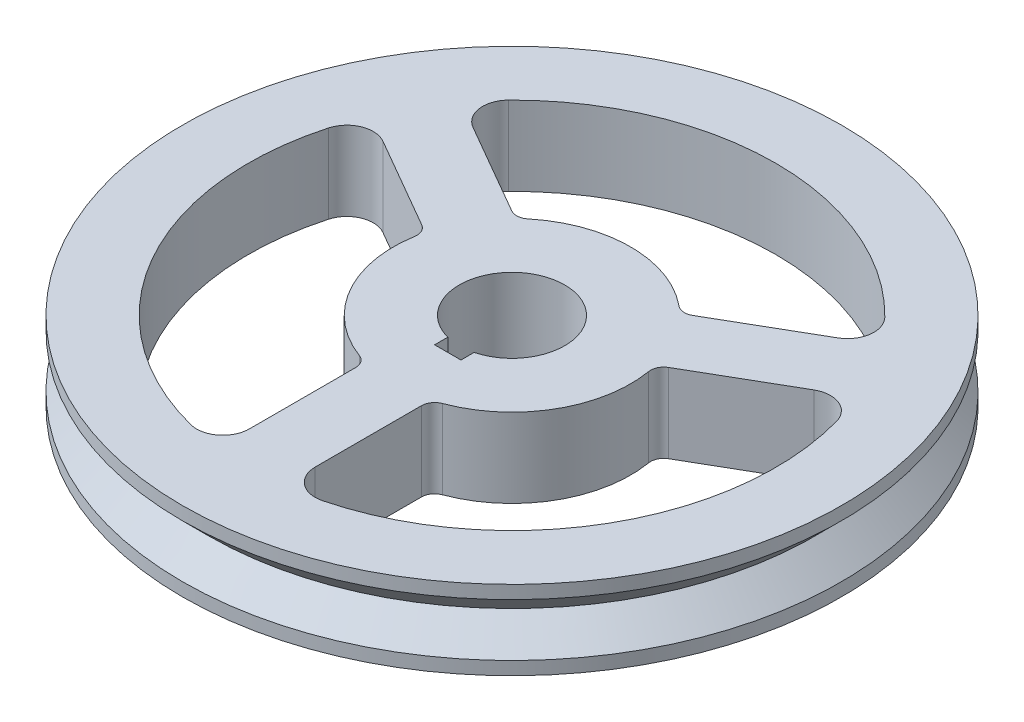
ISO-10303-21;
HEADER;
FILE_DESCRIPTION(('STEP AP214'),'2;1');
FILE_NAME('part.step','',(''),(''),'','','');
FILE_SCHEMA(('AUTOMOTIVE_DESIGN { 1 0 10303 214 1 1 1 1 }'));
ENDSEC;
DATA;
#1=APPLICATION_CONTEXT('core data for automotive mechanical design processes');
#2=APPLICATION_PROTOCOL_DEFINITION('international standard','automotive_design',2000,#1);
#3=PRODUCT_CONTEXT('',#1,'mechanical');
#4=PRODUCT('Part','Part','',(#3));
#5=PRODUCT_RELATED_PRODUCT_CATEGORY('part','',(#4));
#6=PRODUCT_DEFINITION_FORMATION('','',#4);
#7=PRODUCT_DEFINITION_CONTEXT('part definition',#1,'design');
#8=PRODUCT_DEFINITION('design','',#6,#7);
#9=PRODUCT_DEFINITION_SHAPE('','',#8);
#10=(LENGTH_UNIT() NAMED_UNIT(*) SI_UNIT(.MILLI.,.METRE.));
#11=(NAMED_UNIT(*) PLANE_ANGLE_UNIT() SI_UNIT($,.RADIAN.));
#12=(NAMED_UNIT(*) SI_UNIT($,.STERADIAN.) SOLID_ANGLE_UNIT());
#13=UNCERTAINTY_MEASURE_WITH_UNIT(LENGTH_MEASURE(1.E-05),#10,'distance_accuracy_value','');
#14=(GEOMETRIC_REPRESENTATION_CONTEXT(3) GLOBAL_UNCERTAINTY_ASSIGNED_CONTEXT((#13)) GLOBAL_UNIT_ASSIGNED_CONTEXT((#10,
#11,#12)) REPRESENTATION_CONTEXT('',''));
#15=CARTESIAN_POINT('',(0.,0.,0.));
#16=DIRECTION('',(0.,0.,1.));
#17=DIRECTION('',(1.,0.,0.));
#18=AXIS2_PLACEMENT_3D('',#15,#16,#17);
#19=CARTESIAN_POINT('',(0.,15.,0.));
#20=DIRECTION('',(0.,-1.,0.));
#21=DIRECTION('',(0.,0.,-1.));
#22=AXIS2_PLACEMENT_3D('',#19,#20,#21);
#23=CYLINDRICAL_SURFACE('',#22,125.);
#24=CARTESIAN_POINT('',(0.,10.,0.));
#25=DIRECTION('',(0.,1.,0.));
#26=DIRECTION('',(0.,0.,1.));
#27=AXIS2_PLACEMENT_3D('',#24,#25,#26);
#28=CIRCLE('',#27,125.);
#29=CARTESIAN_POINT('',(0.,10.,125.));
#30=VERTEX_POINT('',#29);
#31=EDGE_CURVE('E503',#30,#30,#28,.T.);
#32=ORIENTED_EDGE('',*,*,#31,.T.);
#33=EDGE_LOOP('',(#32));
#34=FACE_BOUND('',#33,.T.);
#35=CARTESIAN_POINT('',(0.,15.,0.));
#36=DIRECTION('',(0.,1.,0.));
#37=DIRECTION('',(0.,0.,1.));
#38=AXIS2_PLACEMENT_3D('',#35,#36,#37);
#39=CIRCLE('',#38,125.);
#40=CARTESIAN_POINT('',(0.,15.,125.));
#41=VERTEX_POINT('',#40);
#42=EDGE_CURVE('E11',#41,#41,#39,.T.);
#43=ORIENTED_EDGE('',*,*,#42,.F.);
#44=EDGE_LOOP('',(#43));
#45=FACE_BOUND('',#44,.T.);
#46=ADVANCED_FACE('F40',(#34,#45),#23,.T.);
#47=CARTESIAN_POINT('',(0.,15.,0.));
#48=DIRECTION('',(0.,1.,0.));
#49=DIRECTION('',(0.,0.,1.));
#50=AXIS2_PLACEMENT_3D('',#47,#48,#49);
#51=PLANE('',#50);
#52=ORIENTED_EDGE('',*,*,#42,.T.);
#53=EDGE_LOOP('',(#52));
#54=FACE_BOUND('',#53,.T.);
#55=DIRECTION('',(0.,0.,-1.));
#56=VECTOR('',#55,1.);
#57=CARTESIAN_POINT('',(-12.5,15.,46.837484987988));
#58=LINE('',#57,#56);
#59=CARTESIAN_POINT('',(-12.4999999999999,15.,87.1421252896669));
#60=VERTEX_POINT('',#59);
#61=CARTESIAN_POINT('',(-12.5,15.,46.837484987988));
#62=VERTEX_POINT('',#61);
#63=EDGE_CURVE('E385',#60,#62,#58,.T.);
#64=ORIENTED_EDGE('',*,*,#63,.F.);
#65=CARTESIAN_POINT('',(-22.5,15.,87.1421252896669));
#66=DIRECTION('',(0.,1.,0.));
#67=DIRECTION('',(0.,0.,-1.));
#68=AXIS2_PLACEMENT_3D('',#65,#66,#67);
#69=CIRCLE('',#68,10.);
#70=CARTESIAN_POINT('',(-25.,15.,96.8245836551854));
#71=VERTEX_POINT('',#70);
#72=EDGE_CURVE('E383',#71,#60,#69,.T.);
#73=ORIENTED_EDGE('',*,*,#72,.F.);
#74=CARTESIAN_POINT('',(0.,15.,0.));
#75=DIRECTION('',(0.,1.,0.));
#76=DIRECTION('',(0.,0.,1.));
#77=AXIS2_PLACEMENT_3D('',#74,#75,#76);
#78=CIRCLE('',#77,100.);
#79=CARTESIAN_POINT('',(-96.352549156242,15.,-26.7616567329822));
#80=VERTEX_POINT('',#79);
#81=EDGE_CURVE('E399',#80,#71,#78,.T.);
#82=ORIENTED_EDGE('',*,*,#81,.F.);
#83=CARTESIAN_POINT('',(-86.7172942406178,15.,-24.085491059684));
#84=DIRECTION('',(0.,1.,0.));
#85=DIRECTION('',(0.,0.,1.));
#86=AXIS2_PLACEMENT_3D('',#83,#84,#85);
#87=CIRCLE('',#86,9.99999999999999);
#88=CARTESIAN_POINT('',(-81.7172942406178,15.,-32.7457450975283));
#89=VERTEX_POINT('',#88);
#90=EDGE_CURVE('E396',#89,#80,#87,.T.);
#91=ORIENTED_EDGE('',*,*,#90,.F.);
#92=DIRECTION('',(-0.866025403784436,0.,-0.500000000000004));
#93=VECTOR('',#92,1.);
#94=CARTESIAN_POINT('',(-46.8124518489698,15.,-12.5934249466887));
#95=LINE('',#94,#93);
#96=CARTESIAN_POINT('',(-46.8124518489698,15.,-12.5934249466887));
#97=VERTEX_POINT('',#96);
#98=EDGE_CURVE('E394',#97,#89,#95,.T.);
#99=ORIENTED_EDGE('',*,*,#98,.F.);
#100=CARTESIAN_POINT('',(-49.3124518489698,15.,-8.26329792776654));
#101=DIRECTION('',(0.,1.,0.));
#102=DIRECTION('',(0.,0.,-1.));
#103=AXIS2_PLACEMENT_3D('',#100,#101,#102);
#104=CIRCLE('',#103,5.);
#105=CARTESIAN_POINT('',(-44.3812066640729,15.,-7.43696813498991));
#106=VERTEX_POINT('',#105);
#107=EDGE_CURVE('E392',#106,#97,#104,.T.);
#108=ORIENTED_EDGE('',*,*,#107,.F.);
#109=CARTESIAN_POINT('',(0.,15.,0.));
#110=DIRECTION('',(0.,-1.,0.));
#111=DIRECTION('',(0.,0.,1.));
#112=AXIS2_PLACEMENT_3D('',#109,#110,#111);
#113=CIRCLE('',#112,45.);
#114=CARTESIAN_POINT('',(-15.75,15.,42.1537364891892));
#115=VERTEX_POINT('',#114);
#116=EDGE_CURVE('E390',#115,#106,#113,.T.);
#117=ORIENTED_EDGE('',*,*,#116,.F.);
#118=CARTESIAN_POINT('',(-17.5,15.,46.837484987988));
#119=DIRECTION('',(0.,1.,0.));
#120=DIRECTION('',(0.,0.,1.));
#121=AXIS2_PLACEMENT_3D('',#118,#119,#120);
#122=CIRCLE('',#121,4.99999999999999);
#123=EDGE_CURVE('E388',#62,#115,#122,.T.);
#124=ORIENTED_EDGE('',*,*,#123,.F.);
#125=EDGE_LOOP('',(#64,#73,#82,#91,#99,#108,#117,#124));
#126=FACE_BOUND('',#125,.T.);
#127=DIRECTION('',(0.,0.,1.));
#128=VECTOR('',#127,1.);
#129=CARTESIAN_POINT('',(-4.99999999999998,15.,19.3649167310371));
#130=LINE('',#129,#128);
#131=CARTESIAN_POINT('',(-4.99999999999998,15.,19.3649167310371));
#132=VERTEX_POINT('',#131);
#133=CARTESIAN_POINT('',(-4.99999999999998,15.,24.3649167310371));
#134=VERTEX_POINT('',#133);
#135=EDGE_CURVE('E354',#132,#134,#130,.T.);
#136=ORIENTED_EDGE('',*,*,#135,.F.);
#137=CARTESIAN_POINT('',(0.,15.,0.));
#138=DIRECTION('',(0.,1.,0.));
#139=DIRECTION('',(0.,0.,1.));
#140=AXIS2_PLACEMENT_3D('',#137,#138,#139);
#141=CIRCLE('',#140,20.);
#142=CARTESIAN_POINT('',(5.00000000000002,15.,19.3649167310371));
#143=VERTEX_POINT('',#142);
#144=EDGE_CURVE('E352',#143,#132,#141,.T.);
#145=ORIENTED_EDGE('',*,*,#144,.F.);
#146=DIRECTION('',(0.,0.,-1.));
#147=VECTOR('',#146,1.);
#148=CARTESIAN_POINT('',(5.00000000000002,15.,19.3649167310371));
#149=LINE('',#148,#147);
#150=CARTESIAN_POINT('',(5.00000000000002,15.,24.3649167310371));
#151=VERTEX_POINT('',#150);
#152=EDGE_CURVE('E360',#151,#143,#149,.T.);
#153=ORIENTED_EDGE('',*,*,#152,.F.);
#154=DIRECTION('',(1.,0.,0.));
#155=VECTOR('',#154,1.);
#156=CARTESIAN_POINT('',(-4.99999999999998,15.,24.3649167310371));
#157=LINE('',#156,#155);
#158=EDGE_CURVE('E357',#134,#151,#157,.T.);
#159=ORIENTED_EDGE('',*,*,#158,.F.);
#160=EDGE_LOOP('',(#136,#145,#153,#159));
#161=FACE_BOUND('',#160,.T.);
#162=DIRECTION('',(0.866025403784436,0.,0.500000000000004));
#163=VECTOR('',#162,1.);
#164=CARTESIAN_POINT('',(-34.3124518489698,15.,-34.2440600412996));
#165=LINE('',#164,#163);
#166=CARTESIAN_POINT('',(-69.2172942406177,15.,-54.3963801921392));
#167=VERTEX_POINT('',#166);
#168=CARTESIAN_POINT('',(-34.3124518489698,15.,-34.2440600412996));
#169=VERTEX_POINT('',#168);
#170=EDGE_CURVE('E295',#167,#169,#165,.T.);
#171=ORIENTED_EDGE('',*,*,#170,.F.);
#172=CARTESIAN_POINT('',(-64.2172942406176,15.,-63.0566342299836));
#173=DIRECTION('',(0.,1.,0.));
#174=DIRECTION('',(0.,0.,-1.));
#175=AXIS2_PLACEMENT_3D('',#172,#173,#174);
#176=CIRCLE('',#175,10.);
#177=CARTESIAN_POINT('',(-71.3525491562418,15.,-70.062926922204));
#178=VERTEX_POINT('',#177);
#179=EDGE_CURVE('E293',#178,#167,#176,.T.);
#180=ORIENTED_EDGE('',*,*,#179,.F.);
#181=CARTESIAN_POINT('',(0.,15.,0.));
#182=DIRECTION('',(0.,1.,0.));
#183=DIRECTION('',(0.,0.,1.));
#184=AXIS2_PLACEMENT_3D('',#181,#182,#183);
#185=CIRCLE('',#184,100.);
#186=CARTESIAN_POINT('',(71.3525491562428,15.,-70.062926922203));
#187=VERTEX_POINT('',#186);
#188=EDGE_CURVE('E309',#187,#178,#185,.T.);
#189=ORIENTED_EDGE('',*,*,#188,.F.);
#190=CARTESIAN_POINT('',(64.2172942406185,15.,-63.0566342299828));
#191=DIRECTION('',(0.,1.,0.));
#192=DIRECTION('',(0.,0.,1.));
#193=AXIS2_PLACEMENT_3D('',#190,#191,#192);
#194=CIRCLE('',#193,9.99999999999999);
#195=CARTESIAN_POINT('',(69.2172942406184,15.,-54.3963801921383));
#196=VERTEX_POINT('',#195);
#197=EDGE_CURVE('E306',#196,#187,#194,.T.);
#198=ORIENTED_EDGE('',*,*,#197,.F.);
#199=DIRECTION('',(0.866025403784443,0.,-0.499999999999992));
#200=VECTOR('',#199,1.);
#201=CARTESIAN_POINT('',(34.3124518489702,15.,-34.2440600412992));
#202=LINE('',#201,#200);
#203=CARTESIAN_POINT('',(34.3124518489702,15.,-34.2440600412992));
#204=VERTEX_POINT('',#203);
#205=EDGE_CURVE('E304',#204,#196,#202,.T.);
#206=ORIENTED_EDGE('',*,*,#205,.F.);
#207=CARTESIAN_POINT('',(31.8124518489702,15.,-38.5741870602214));
#208=DIRECTION('',(0.,1.,0.));
#209=DIRECTION('',(0.,0.,-1.));
#210=AXIS2_PLACEMENT_3D('',#207,#208,#209);
#211=CIRCLE('',#210,4.99999999999999);
#212=CARTESIAN_POINT('',(28.6312066640732,15.,-34.7167683541992));
#213=VERTEX_POINT('',#212);
#214=EDGE_CURVE('E302',#213,#204,#211,.T.);
#215=ORIENTED_EDGE('',*,*,#214,.F.);
#216=CARTESIAN_POINT('',(0.,15.,0.));
#217=DIRECTION('',(0.,-1.,0.));
#218=DIRECTION('',(0.,0.,1.));
#219=AXIS2_PLACEMENT_3D('',#216,#217,#218);
#220=CIRCLE('',#219,45.);
#221=CARTESIAN_POINT('',(-28.6312066640727,15.,-34.7167683541996));
#222=VERTEX_POINT('',#221);
#223=EDGE_CURVE('E300',#222,#213,#220,.T.);
#224=ORIENTED_EDGE('',*,*,#223,.F.);
#225=CARTESIAN_POINT('',(-31.8124518489697,15.,-38.5741870602218));
#226=DIRECTION('',(0.,1.,0.));
#227=DIRECTION('',(0.,0.,1.));
#228=AXIS2_PLACEMENT_3D('',#225,#226,#227);
#229=CIRCLE('',#228,5.);
#230=EDGE_CURVE('E298',#169,#222,#229,.T.);
#231=ORIENTED_EDGE('',*,*,#230,.F.);
#232=EDGE_LOOP('',(#171,#180,#189,#198,#206,#215,#224,#231));
#233=FACE_BOUND('',#232,.T.);
#234=DIRECTION('',(-0.866025403784443,0.,0.499999999999992));
#235=VECTOR('',#234,1.);
#236=CARTESIAN_POINT('',(46.81245184897,15.,-12.5934249466881));
#237=LINE('',#236,#235);
#238=CARTESIAN_POINT('',(81.7172942406182,15.,-32.7457450975272));
#239=VERTEX_POINT('',#238);
#240=CARTESIAN_POINT('',(46.81245184897,15.,-12.5934249466881));
#241=VERTEX_POINT('',#240);
#242=EDGE_CURVE('E233',#239,#241,#237,.T.);
#243=ORIENTED_EDGE('',*,*,#242,.F.);
#244=CARTESIAN_POINT('',(86.7172942406181,15.,-24.0854910596828));
#245=DIRECTION('',(0.,1.,0.));
#246=DIRECTION('',(0.,0.,-1.));
#247=AXIS2_PLACEMENT_3D('',#244,#245,#246);
#248=CIRCLE('',#247,9.99999999999999);
#249=CARTESIAN_POINT('',(96.3525491562423,15.,-26.7616567329809));
#250=VERTEX_POINT('',#249);
#251=EDGE_CURVE('E225',#250,#239,#248,.T.);
#252=ORIENTED_EDGE('',*,*,#251,.F.);
#253=CARTESIAN_POINT('',(0.,15.,0.));
#254=DIRECTION('',(0.,1.,0.));
#255=DIRECTION('',(0.,0.,1.));
#256=AXIS2_PLACEMENT_3D('',#253,#254,#255);
#257=CIRCLE('',#256,100.);
#258=CARTESIAN_POINT('',(24.9999999999986,15.,96.8245836551857));
#259=VERTEX_POINT('',#258);
#260=EDGE_CURVE('E260',#259,#250,#257,.T.);
#261=ORIENTED_EDGE('',*,*,#260,.F.);
#262=CARTESIAN_POINT('',(22.4999999999996,15.,87.142125289667));
#263=DIRECTION('',(0.,1.,0.));
#264=DIRECTION('',(0.,0.,1.));
#265=AXIS2_PLACEMENT_3D('',#262,#263,#264);
#266=CIRCLE('',#265,10.0000000000004);
#267=CARTESIAN_POINT('',(12.4999999999988,15.,87.142125289667));
#268=VERTEX_POINT('',#267);
#269=EDGE_CURVE('E258',#268,#259,#266,.T.);
#270=ORIENTED_EDGE('',*,*,#269,.F.);
#271=DIRECTION('',(0.,0.,1.));
#272=VECTOR('',#271,1.);
#273=CARTESIAN_POINT('',(12.4999999999994,15.,46.8374849879882));
#274=LINE('',#273,#272);
#275=CARTESIAN_POINT('',(12.4999999999996,15.,46.8374849879882));
#276=VERTEX_POINT('',#275);
#277=EDGE_CURVE('E256',#276,#268,#274,.T.);
#278=ORIENTED_EDGE('',*,*,#277,.F.);
#279=CARTESIAN_POINT('',(17.4999999999998,15.,46.8374849879881));
#280=DIRECTION('',(0.,1.,0.));
#281=DIRECTION('',(0.,0.,-1.));
#282=AXIS2_PLACEMENT_3D('',#279,#280,#281);
#283=CIRCLE('',#282,5.00000000000022);
#284=CARTESIAN_POINT('',(15.7499999999994,15.,42.1537364891894));
#285=VERTEX_POINT('',#284);
#286=EDGE_CURVE('E254',#285,#276,#283,.T.);
#287=ORIENTED_EDGE('',*,*,#286,.F.);
#288=CARTESIAN_POINT('',(0.,15.,0.));
#289=DIRECTION('',(0.,-1.,0.));
#290=DIRECTION('',(0.,0.,1.));
#291=AXIS2_PLACEMENT_3D('',#288,#289,#290);
#292=CIRCLE('',#291,45.);
#293=CARTESIAN_POINT('',(44.3812066640729,15.,-7.4369681349893));
#294=VERTEX_POINT('',#293);
#295=EDGE_CURVE('E249',#294,#285,#292,.T.);
#296=ORIENTED_EDGE('',*,*,#295,.F.);
#297=CARTESIAN_POINT('',(49.3124518489699,15.,-8.26329792776589));
#298=DIRECTION('',(0.,1.,0.));
#299=DIRECTION('',(0.,0.,1.));
#300=AXIS2_PLACEMENT_3D('',#297,#298,#299);
#301=CIRCLE('',#300,5.);
#302=EDGE_CURVE('E247',#241,#294,#301,.T.);
#303=ORIENTED_EDGE('',*,*,#302,.F.);
#304=EDGE_LOOP('',(#243,#252,#261,#270,#278,#287,#296,#303));
#305=FACE_BOUND('',#304,.T.);
#306=ADVANCED_FACE('F245',(#54,#126,#161,#233,#305),#51,.T.);
#307=CARTESIAN_POINT('',(0.,-15.,0.));
#308=DIRECTION('',(0.,1.,0.));
#309=DIRECTION('',(0.,0.,1.));
#310=AXIS2_PLACEMENT_3D('',#307,#308,#309);
#311=PLANE('',#310);
#312=CARTESIAN_POINT('',(-64.2172942406176,-15.,-63.0566342299836));
#313=DIRECTION('',(0.,1.,0.));
#314=DIRECTION('',(0.,0.,-1.));
#315=AXIS2_PLACEMENT_3D('',#312,#313,#314);
#316=CIRCLE('',#315,10.);
#317=CARTESIAN_POINT('',(-71.3525491562418,-15.,-70.062926922204));
#318=VERTEX_POINT('',#317);
#319=CARTESIAN_POINT('',(-69.2172942406177,-15.,-54.3963801921392));
#320=VERTEX_POINT('',#319);
#321=EDGE_CURVE('E241',#318,#320,#316,.T.);
#322=ORIENTED_EDGE('',*,*,#321,.T.);
#323=DIRECTION('',(0.866025403784436,0.,0.500000000000004));
#324=VECTOR('',#323,1.);
#325=CARTESIAN_POINT('',(-34.3124518489698,-15.,-34.2440600412996));
#326=LINE('',#325,#324);
#327=CARTESIAN_POINT('',(-34.3124518489698,-15.,-34.2440600412996));
#328=VERTEX_POINT('',#327);
#329=EDGE_CURVE('E314',#320,#328,#326,.T.);
#330=ORIENTED_EDGE('',*,*,#329,.T.);
#331=CARTESIAN_POINT('',(-31.8124518489697,-15.,-38.5741870602218));
#332=DIRECTION('',(0.,1.,0.));
#333=DIRECTION('',(0.,0.,1.));
#334=AXIS2_PLACEMENT_3D('',#331,#332,#333);
#335=CIRCLE('',#334,5.);
#336=CARTESIAN_POINT('',(-28.6312066640727,-15.,-34.7167683541996));
#337=VERTEX_POINT('',#336);
#338=EDGE_CURVE('E317',#328,#337,#335,.T.);
#339=ORIENTED_EDGE('',*,*,#338,.T.);
#340=CARTESIAN_POINT('',(0.,-15.,0.));
#341=DIRECTION('',(0.,-1.,0.));
#342=DIRECTION('',(0.,0.,1.));
#343=AXIS2_PLACEMENT_3D('',#340,#341,#342);
#344=CIRCLE('',#343,45.);
#345=CARTESIAN_POINT('',(28.6312066640732,-15.,-34.7167683541992));
#346=VERTEX_POINT('',#345);
#347=EDGE_CURVE('E320',#337,#346,#344,.T.);
#348=ORIENTED_EDGE('',*,*,#347,.T.);
#349=CARTESIAN_POINT('',(31.8124518489702,-15.,-38.5741870602214));
#350=DIRECTION('',(0.,1.,0.));
#351=DIRECTION('',(0.,0.,-1.));
#352=AXIS2_PLACEMENT_3D('',#349,#350,#351);
#353=CIRCLE('',#352,4.99999999999999);
#354=CARTESIAN_POINT('',(34.3124518489702,-15.,-34.2440600412992));
#355=VERTEX_POINT('',#354);
#356=EDGE_CURVE('E323',#346,#355,#353,.T.);
#357=ORIENTED_EDGE('',*,*,#356,.T.);
#358=DIRECTION('',(0.866025403784443,0.,-0.499999999999992));
#359=VECTOR('',#358,1.);
#360=CARTESIAN_POINT('',(34.3124518489702,-15.,-34.2440600412992));
#361=LINE('',#360,#359);
#362=CARTESIAN_POINT('',(69.2172942406184,-15.,-54.3963801921383));
#363=VERTEX_POINT('',#362);
#364=EDGE_CURVE('E326',#355,#363,#361,.T.);
#365=ORIENTED_EDGE('',*,*,#364,.T.);
#366=CARTESIAN_POINT('',(64.2172942406185,-15.,-63.0566342299828));
#367=DIRECTION('',(0.,1.,0.));
#368=DIRECTION('',(0.,0.,1.));
#369=AXIS2_PLACEMENT_3D('',#366,#367,#368);
#370=CIRCLE('',#369,9.99999999999999);
#371=CARTESIAN_POINT('',(71.3525491562428,-15.,-70.062926922203));
#372=VERTEX_POINT('',#371);
#373=EDGE_CURVE('E329',#363,#372,#370,.T.);
#374=ORIENTED_EDGE('',*,*,#373,.T.);
#375=CARTESIAN_POINT('',(0.,-15.,0.));
#376=DIRECTION('',(0.,1.,0.));
#377=DIRECTION('',(0.,0.,1.));
#378=AXIS2_PLACEMENT_3D('',#375,#376,#377);
#379=CIRCLE('',#378,100.);
#380=EDGE_CURVE('E296',#372,#318,#379,.T.);
#381=ORIENTED_EDGE('',*,*,#380,.T.);
#382=EDGE_LOOP('',(#322,#330,#339,#348,#357,#365,#374,#381));
#383=FACE_BOUND('',#382,.T.);
#384=CARTESIAN_POINT('',(-22.5,-15.,87.1421252896669));
#385=DIRECTION('',(0.,1.,0.));
#386=DIRECTION('',(0.,0.,-1.));
#387=AXIS2_PLACEMENT_3D('',#384,#385,#386);
#388=CIRCLE('',#387,10.);
#389=CARTESIAN_POINT('',(-25.,-15.,96.8245836551854));
#390=VERTEX_POINT('',#389);
#391=CARTESIAN_POINT('',(-12.4999999999999,-15.,87.1421252896669));
#392=VERTEX_POINT('',#391);
#393=EDGE_CURVE('E382',#390,#392,#388,.T.);
#394=ORIENTED_EDGE('',*,*,#393,.T.);
#395=DIRECTION('',(0.,0.,-1.));
#396=VECTOR('',#395,1.);
#397=CARTESIAN_POINT('',(-12.5,-15.,46.837484987988));
#398=LINE('',#397,#396);
#399=CARTESIAN_POINT('',(-12.5,-15.,46.837484987988));
#400=VERTEX_POINT('',#399);
#401=EDGE_CURVE('E404',#392,#400,#398,.T.);
#402=ORIENTED_EDGE('',*,*,#401,.T.);
#403=CARTESIAN_POINT('',(-17.5,-15.,46.837484987988));
#404=DIRECTION('',(0.,1.,0.));
#405=DIRECTION('',(0.,0.,1.));
#406=AXIS2_PLACEMENT_3D('',#403,#404,#405);
#407=CIRCLE('',#406,4.99999999999999);
#408=CARTESIAN_POINT('',(-15.75,-15.,42.1537364891892));
#409=VERTEX_POINT('',#408);
#410=EDGE_CURVE('E407',#400,#409,#407,.T.);
#411=ORIENTED_EDGE('',*,*,#410,.T.);
#412=CARTESIAN_POINT('',(0.,-15.,0.));
#413=DIRECTION('',(0.,-1.,0.));
#414=DIRECTION('',(0.,0.,1.));
#415=AXIS2_PLACEMENT_3D('',#412,#413,#414);
#416=CIRCLE('',#415,45.);
#417=CARTESIAN_POINT('',(-44.3812066640729,-15.,-7.43696813498991));
#418=VERTEX_POINT('',#417);
#419=EDGE_CURVE('E410',#409,#418,#416,.T.);
#420=ORIENTED_EDGE('',*,*,#419,.T.);
#421=CARTESIAN_POINT('',(-49.3124518489698,-15.,-8.26329792776654));
#422=DIRECTION('',(0.,1.,0.));
#423=DIRECTION('',(0.,0.,-1.));
#424=AXIS2_PLACEMENT_3D('',#421,#422,#423);
#425=CIRCLE('',#424,5.);
#426=CARTESIAN_POINT('',(-46.8124518489698,-15.,-12.5934249466887));
#427=VERTEX_POINT('',#426);
#428=EDGE_CURVE('E413',#418,#427,#425,.T.);
#429=ORIENTED_EDGE('',*,*,#428,.T.);
#430=DIRECTION('',(-0.866025403784436,0.,-0.500000000000004));
#431=VECTOR('',#430,1.);
#432=CARTESIAN_POINT('',(-46.8124518489698,-15.,-12.5934249466887));
#433=LINE('',#432,#431);
#434=CARTESIAN_POINT('',(-81.7172942406178,-15.,-32.7457450975283));
#435=VERTEX_POINT('',#434);
#436=EDGE_CURVE('E416',#427,#435,#433,.T.);
#437=ORIENTED_EDGE('',*,*,#436,.T.);
#438=CARTESIAN_POINT('',(-86.7172942406178,-15.,-24.085491059684));
#439=DIRECTION('',(0.,1.,0.));
#440=DIRECTION('',(0.,0.,1.));
#441=AXIS2_PLACEMENT_3D('',#438,#439,#440);
#442=CIRCLE('',#441,9.99999999999999);
#443=CARTESIAN_POINT('',(-96.352549156242,-15.,-26.7616567329822));
#444=VERTEX_POINT('',#443);
#445=EDGE_CURVE('E419',#435,#444,#442,.T.);
#446=ORIENTED_EDGE('',*,*,#445,.T.);
#447=CARTESIAN_POINT('',(0.,-15.,0.));
#448=DIRECTION('',(0.,1.,0.));
#449=DIRECTION('',(0.,0.,1.));
#450=AXIS2_PLACEMENT_3D('',#447,#448,#449);
#451=CIRCLE('',#450,100.);
#452=EDGE_CURVE('E386',#444,#390,#451,.T.);
#453=ORIENTED_EDGE('',*,*,#452,.T.);
#454=EDGE_LOOP('',(#394,#402,#411,#420,#429,#437,#446,#453));
#455=FACE_BOUND('',#454,.T.);
#456=CARTESIAN_POINT('',(0.,-15.,0.));
#457=DIRECTION('',(0.,1.,0.));
#458=DIRECTION('',(0.,0.,1.));
#459=AXIS2_PLACEMENT_3D('',#456,#457,#458);
#460=CIRCLE('',#459,125.);
#461=CARTESIAN_POINT('',(0.,-15.,125.));
#462=VERTEX_POINT('',#461);
#463=EDGE_CURVE('E44',#462,#462,#460,.T.);
#464=ORIENTED_EDGE('',*,*,#463,.F.);
#465=EDGE_LOOP('',(#464));
#466=FACE_BOUND('',#465,.T.);
#467=CARTESIAN_POINT('',(0.,-15.,0.));
#468=DIRECTION('',(0.,1.,0.));
#469=DIRECTION('',(0.,0.,1.));
#470=AXIS2_PLACEMENT_3D('',#467,#468,#469);
#471=CIRCLE('',#470,20.);
#472=CARTESIAN_POINT('',(5.00000000000002,-15.,19.3649167310371));
#473=VERTEX_POINT('',#472);
#474=CARTESIAN_POINT('',(-4.99999999999998,-15.,19.3649167310371));
#475=VERTEX_POINT('',#474);
#476=EDGE_CURVE('E351',#473,#475,#471,.T.);
#477=ORIENTED_EDGE('',*,*,#476,.T.);
#478=DIRECTION('',(0.,0.,1.));
#479=VECTOR('',#478,1.);
#480=CARTESIAN_POINT('',(-4.99999999999998,-15.,19.3649167310371));
#481=LINE('',#480,#479);
#482=CARTESIAN_POINT('',(-4.99999999999998,-15.,24.3649167310371));
#483=VERTEX_POINT('',#482);
#484=EDGE_CURVE('E365',#475,#483,#481,.T.);
#485=ORIENTED_EDGE('',*,*,#484,.T.);
#486=DIRECTION('',(1.,0.,0.));
#487=VECTOR('',#486,1.);
#488=CARTESIAN_POINT('',(-4.99999999999998,-15.,24.3649167310371));
#489=LINE('',#488,#487);
#490=CARTESIAN_POINT('',(5.00000000000002,-15.,24.3649167310371));
#491=VERTEX_POINT('',#490);
#492=EDGE_CURVE('E368',#483,#491,#489,.T.);
#493=ORIENTED_EDGE('',*,*,#492,.T.);
#494=DIRECTION('',(0.,0.,-1.));
#495=VECTOR('',#494,1.);
#496=CARTESIAN_POINT('',(5.00000000000002,-15.,19.3649167310371));
#497=LINE('',#496,#495);
#498=EDGE_CURVE('E355',#491,#473,#497,.T.);
#499=ORIENTED_EDGE('',*,*,#498,.T.);
#500=EDGE_LOOP('',(#477,#485,#493,#499));
#501=FACE_BOUND('',#500,.T.);
#502=CARTESIAN_POINT('',(86.7172942406181,-15.,-24.0854910596828));
#503=DIRECTION('',(0.,1.,0.));
#504=DIRECTION('',(0.,0.,-1.));
#505=AXIS2_PLACEMENT_3D('',#502,#503,#504);
#506=CIRCLE('',#505,9.99999999999999);
#507=CARTESIAN_POINT('',(96.3525491562423,-15.,-26.7616567329809));
#508=VERTEX_POINT('',#507);
#509=CARTESIAN_POINT('',(81.7172942406182,-15.,-32.7457450975272));
#510=VERTEX_POINT('',#509);
#511=EDGE_CURVE('E63',#508,#510,#506,.T.);
#512=ORIENTED_EDGE('',*,*,#511,.T.);
#513=DIRECTION('',(-0.866025403784443,0.,0.499999999999992));
#514=VECTOR('',#513,1.);
#515=CARTESIAN_POINT('',(46.81245184897,-15.,-12.5934249466881));
#516=LINE('',#515,#514);
#517=CARTESIAN_POINT('',(46.81245184897,-15.,-12.5934249466881));
#518=VERTEX_POINT('',#517);
#519=EDGE_CURVE('E240',#510,#518,#516,.T.);
#520=ORIENTED_EDGE('',*,*,#519,.T.);
#521=CARTESIAN_POINT('',(49.3124518489699,-15.,-8.26329792776589));
#522=DIRECTION('',(0.,1.,0.));
#523=DIRECTION('',(0.,0.,1.));
#524=AXIS2_PLACEMENT_3D('',#521,#522,#523);
#525=CIRCLE('',#524,5.);
#526=CARTESIAN_POINT('',(44.3812066640729,-15.,-7.4369681349893));
#527=VERTEX_POINT('',#526);
#528=EDGE_CURVE('E265',#518,#527,#525,.T.);
#529=ORIENTED_EDGE('',*,*,#528,.T.);
#530=CARTESIAN_POINT('',(0.,-15.,0.));
#531=DIRECTION('',(0.,-1.,0.));
#532=DIRECTION('',(0.,0.,1.));
#533=AXIS2_PLACEMENT_3D('',#530,#531,#532);
#534=CIRCLE('',#533,45.);
#535=CARTESIAN_POINT('',(15.7499999999994,-15.,42.1537364891894));
#536=VERTEX_POINT('',#535);
#537=EDGE_CURVE('E268',#527,#536,#534,.T.);
#538=ORIENTED_EDGE('',*,*,#537,.T.);
#539=CARTESIAN_POINT('',(17.4999999999998,-15.,46.8374849879881));
#540=DIRECTION('',(0.,1.,0.));
#541=DIRECTION('',(0.,0.,-1.));
#542=AXIS2_PLACEMENT_3D('',#539,#540,#541);
#543=CIRCLE('',#542,5.00000000000022);
#544=CARTESIAN_POINT('',(12.4999999999996,-15.,46.8374849879882));
#545=VERTEX_POINT('',#544);
#546=EDGE_CURVE('E271',#536,#545,#543,.T.);
#547=ORIENTED_EDGE('',*,*,#546,.T.);
#548=DIRECTION('',(0.,0.,1.));
#549=VECTOR('',#548,1.);
#550=CARTESIAN_POINT('',(12.4999999999994,-15.,46.8374849879882));
#551=LINE('',#550,#549);
#552=CARTESIAN_POINT('',(12.4999999999988,-15.,87.142125289667));
#553=VERTEX_POINT('',#552);
#554=EDGE_CURVE('E274',#545,#553,#551,.T.);
#555=ORIENTED_EDGE('',*,*,#554,.T.);
#556=CARTESIAN_POINT('',(22.4999999999996,-15.,87.142125289667));
#557=DIRECTION('',(0.,1.,0.));
#558=DIRECTION('',(0.,0.,1.));
#559=AXIS2_PLACEMENT_3D('',#556,#557,#558);
#560=CIRCLE('',#559,10.0000000000004);
#561=CARTESIAN_POINT('',(24.9999999999988,-15.,96.8245836551862));
#562=VERTEX_POINT('',#561);
#563=EDGE_CURVE('E277',#553,#562,#560,.T.);
#564=ORIENTED_EDGE('',*,*,#563,.T.);
#565=CARTESIAN_POINT('',(0.,-15.,0.));
#566=DIRECTION('',(0.,1.,0.));
#567=DIRECTION('',(0.,0.,1.));
#568=AXIS2_PLACEMENT_3D('',#565,#566,#567);
#569=CIRCLE('',#568,100.);
#570=EDGE_CURVE('E234',#562,#508,#569,.T.);
#571=ORIENTED_EDGE('',*,*,#570,.T.);
#572=EDGE_LOOP('',(#512,#520,#529,#538,#547,#555,#564,#571));
#573=FACE_BOUND('',#572,.T.);
#574=ADVANCED_FACE('F446',(#383,#455,#466,#501,#573),#311,.F.);
#575=CARTESIAN_POINT('',(0.,-9.99999999999999,0.));
#576=DIRECTION('',(0.,1.,0.));
#577=DIRECTION('',(0.,0.,1.));
#578=AXIS2_PLACEMENT_3D('',#575,#576,#577);
#579=CIRCLE('',#578,125.);
#580=CARTESIAN_POINT('',(0.,-9.99999999999999,125.));
#581=VERTEX_POINT('',#580);
#582=EDGE_CURVE('E501',#581,#581,#579,.T.);
#583=ORIENTED_EDGE('',*,*,#582,.F.);
#584=EDGE_LOOP('',(#583));
#585=FACE_BOUND('',#584,.T.);
#586=ORIENTED_EDGE('',*,*,#463,.T.);
#587=EDGE_LOOP('',(#586));
#588=FACE_BOUND('',#587,.T.);
#589=ADVANCED_FACE('F42',(#585,#588),#23,.T.);
#590=CARTESIAN_POINT('',(-22.5,15.,87.1421252896669));
#591=DIRECTION('',(0.,-1.,0.));
#592=DIRECTION('',(0.,0.,-1.));
#593=AXIS2_PLACEMENT_3D('',#590,#591,#592);
#594=CYLINDRICAL_SURFACE('',#593,10.);
#595=ORIENTED_EDGE('',*,*,#393,.F.);
#596=DIRECTION('',(0.,-1.,0.));
#597=VECTOR('',#596,1.);
#598=CARTESIAN_POINT('',(-25.,15.,96.8245836551854));
#599=LINE('',#598,#597);
#600=EDGE_CURVE('E401',#71,#390,#599,.T.);
#601=ORIENTED_EDGE('',*,*,#600,.F.);
#602=ORIENTED_EDGE('',*,*,#72,.T.);
#603=DIRECTION('',(0.,-1.,0.));
#604=VECTOR('',#603,1.);
#605=CARTESIAN_POINT('',(-12.4999999999999,15.,87.1421252896669));
#606=LINE('',#605,#604);
#607=EDGE_CURVE('E438',#60,#392,#606,.T.);
#608=ORIENTED_EDGE('',*,*,#607,.T.);
#609=EDGE_LOOP('',(#595,#601,#602,#608));
#610=FACE_BOUND('',#609,.T.);
#611=ADVANCED_FACE('F492',(#610),#594,.F.);
#612=CARTESIAN_POINT('',(-12.5,15.,46.837484987988));
#613=DIRECTION('',(-1.,0.,0.));
#614=DIRECTION('',(0.,0.,1.));
#615=AXIS2_PLACEMENT_3D('',#612,#613,#614);
#616=PLANE('',#615);
#617=ORIENTED_EDGE('',*,*,#401,.F.);
#618=ORIENTED_EDGE('',*,*,#607,.F.);
#619=ORIENTED_EDGE('',*,*,#63,.T.);
#620=DIRECTION('',(0.,-1.,0.));
#621=VECTOR('',#620,1.);
#622=CARTESIAN_POINT('',(-12.5,15.,46.837484987988));
#623=LINE('',#622,#621);
#624=EDGE_CURVE('E436',#62,#400,#623,.T.);
#625=ORIENTED_EDGE('',*,*,#624,.T.);
#626=EDGE_LOOP('',(#617,#618,#619,#625));
#627=FACE_BOUND('',#626,.T.);
#628=ADVANCED_FACE('F497',(#627),#616,.T.);
#629=CARTESIAN_POINT('',(-17.5,15.,46.837484987988));
#630=DIRECTION('',(0.,-1.,0.));
#631=DIRECTION('',(0.,0.,-1.));
#632=AXIS2_PLACEMENT_3D('',#629,#630,#631);
#633=CYLINDRICAL_SURFACE('',#632,4.99999999999999);
#634=ORIENTED_EDGE('',*,*,#410,.F.);
#635=ORIENTED_EDGE('',*,*,#624,.F.);
#636=ORIENTED_EDGE('',*,*,#123,.T.);
#637=DIRECTION('',(0.,-1.,0.));
#638=VECTOR('',#637,1.);
#639=CARTESIAN_POINT('',(-15.75,15.,42.1537364891892));
#640=LINE('',#639,#638);
#641=EDGE_CURVE('E434',#115,#409,#640,.T.);
#642=ORIENTED_EDGE('',*,*,#641,.T.);
#643=EDGE_LOOP('',(#634,#635,#636,#642));
#644=FACE_BOUND('',#643,.T.);
#645=ADVANCED_FACE('F774',(#644),#633,.F.);
#646=CARTESIAN_POINT('',(0.,15.,0.));
#647=DIRECTION('',(0.,-1.,0.));
#648=DIRECTION('',(0.,0.,-1.));
#649=AXIS2_PLACEMENT_3D('',#646,#647,#648);
#650=CYLINDRICAL_SURFACE('',#649,45.);
#651=ORIENTED_EDGE('',*,*,#419,.F.);
#652=ORIENTED_EDGE('',*,*,#641,.F.);
#653=ORIENTED_EDGE('',*,*,#116,.T.);
#654=DIRECTION('',(0.,-1.,0.));
#655=VECTOR('',#654,1.);
#656=CARTESIAN_POINT('',(-44.3812066640729,15.,-7.43696813498991));
#657=LINE('',#656,#655);
#658=EDGE_CURVE('E432',#106,#418,#657,.T.);
#659=ORIENTED_EDGE('',*,*,#658,.T.);
#660=EDGE_LOOP('',(#651,#652,#653,#659));
#661=FACE_BOUND('',#660,.T.);
#662=ADVANCED_FACE('F764',(#661),#650,.T.);
#663=CARTESIAN_POINT('',(-49.3124518489698,15.,-8.26329792776654));
#664=DIRECTION('',(0.,-1.,0.));
#665=DIRECTION('',(0.,0.,-1.));
#666=AXIS2_PLACEMENT_3D('',#663,#664,#665);
#667=CYLINDRICAL_SURFACE('',#666,5.);
#668=ORIENTED_EDGE('',*,*,#428,.F.);
#669=ORIENTED_EDGE('',*,*,#658,.F.);
#670=ORIENTED_EDGE('',*,*,#107,.T.);
#671=DIRECTION('',(0.,-1.,0.));
#672=VECTOR('',#671,1.);
#673=CARTESIAN_POINT('',(-46.8124518489698,15.,-12.5934249466887));
#674=LINE('',#673,#672);
#675=EDGE_CURVE('E430',#97,#427,#674,.T.);
#676=ORIENTED_EDGE('',*,*,#675,.T.);
#677=EDGE_LOOP('',(#668,#669,#670,#676));
#678=FACE_BOUND('',#677,.T.);
#679=ADVANCED_FACE('F754',(#678),#667,.F.);
#680=CARTESIAN_POINT('',(-46.8124518489698,15.,-12.5934249466887));
#681=DIRECTION('',(-0.500000000000004,0.,0.866025403784436));
#682=DIRECTION('',(0.866025403784437,0.,0.500000000000004));
#683=AXIS2_PLACEMENT_3D('',#680,#681,#682);
#684=PLANE('',#683);
#685=ORIENTED_EDGE('',*,*,#436,.F.);
#686=ORIENTED_EDGE('',*,*,#675,.F.);
#687=ORIENTED_EDGE('',*,*,#98,.T.);
#688=DIRECTION('',(0.,-1.,0.));
#689=VECTOR('',#688,1.);
#690=CARTESIAN_POINT('',(-81.7172942406178,15.,-32.7457450975283));
#691=LINE('',#690,#689);
#692=EDGE_CURVE('E428',#89,#435,#691,.T.);
#693=ORIENTED_EDGE('',*,*,#692,.T.);
#694=EDGE_LOOP('',(#685,#686,#687,#693));
#695=FACE_BOUND('',#694,.T.);
#696=ADVANCED_FACE('F744',(#695),#684,.T.);
#697=CARTESIAN_POINT('',(-86.7172942406178,15.,-24.085491059684));
#698=DIRECTION('',(0.,-1.,0.));
#699=DIRECTION('',(0.,0.,-1.));
#700=AXIS2_PLACEMENT_3D('',#697,#698,#699);
#701=CYLINDRICAL_SURFACE('',#700,9.99999999999999);
#702=ORIENTED_EDGE('',*,*,#445,.F.);
#703=ORIENTED_EDGE('',*,*,#692,.F.);
#704=ORIENTED_EDGE('',*,*,#90,.T.);
#705=DIRECTION('',(0.,-1.,0.));
#706=VECTOR('',#705,1.);
#707=CARTESIAN_POINT('',(-96.352549156242,15.,-26.7616567329822));
#708=LINE('',#707,#706);
#709=EDGE_CURVE('E426',#80,#444,#708,.T.);
#710=ORIENTED_EDGE('',*,*,#709,.T.);
#711=EDGE_LOOP('',(#702,#703,#704,#710));
#712=FACE_BOUND('',#711,.T.);
#713=ADVANCED_FACE('F734',(#712),#701,.F.);
#714=CARTESIAN_POINT('',(0.,15.,0.));
#715=DIRECTION('',(0.,-1.,0.));
#716=DIRECTION('',(0.,0.,-1.));
#717=AXIS2_PLACEMENT_3D('',#714,#715,#716);
#718=CYLINDRICAL_SURFACE('',#717,100.);
#719=ORIENTED_EDGE('',*,*,#452,.F.);
#720=ORIENTED_EDGE('',*,*,#709,.F.);
#721=ORIENTED_EDGE('',*,*,#81,.T.);
#722=ORIENTED_EDGE('',*,*,#600,.T.);
#723=EDGE_LOOP('',(#719,#720,#721,#722));
#724=FACE_BOUND('',#723,.T.);
#725=ADVANCED_FACE('F724',(#724),#718,.F.);
#726=CARTESIAN_POINT('',(0.,15.,0.));
#727=DIRECTION('',(0.,-1.,0.));
#728=DIRECTION('',(0.,0.,-1.));
#729=AXIS2_PLACEMENT_3D('',#726,#727,#728);
#730=CYLINDRICAL_SURFACE('',#729,20.);
#731=ORIENTED_EDGE('',*,*,#476,.F.);
#732=DIRECTION('',(0.,-1.,0.));
#733=VECTOR('',#732,1.);
#734=CARTESIAN_POINT('',(5.00000000000002,15.,19.3649167310371));
#735=LINE('',#734,#733);
#736=EDGE_CURVE('E362',#143,#473,#735,.T.);
#737=ORIENTED_EDGE('',*,*,#736,.F.);
#738=ORIENTED_EDGE('',*,*,#144,.T.);
#739=DIRECTION('',(0.,-1.,0.));
#740=VECTOR('',#739,1.);
#741=CARTESIAN_POINT('',(-4.99999999999998,15.,19.3649167310371));
#742=LINE('',#741,#740);
#743=EDGE_CURVE('E379',#132,#475,#742,.T.);
#744=ORIENTED_EDGE('',*,*,#743,.T.);
#745=EDGE_LOOP('',(#731,#737,#738,#744));
#746=FACE_BOUND('',#745,.T.);
#747=ADVANCED_FACE('F714',(#746),#730,.F.);
#748=CARTESIAN_POINT('',(-4.99999999999998,15.,19.3649167310371));
#749=DIRECTION('',(1.,0.,0.));
#750=DIRECTION('',(0.,0.,-1.));
#751=AXIS2_PLACEMENT_3D('',#748,#749,#750);
#752=PLANE('',#751);
#753=ORIENTED_EDGE('',*,*,#484,.F.);
#754=ORIENTED_EDGE('',*,*,#743,.F.);
#755=ORIENTED_EDGE('',*,*,#135,.T.);
#756=DIRECTION('',(0.,-1.,0.));
#757=VECTOR('',#756,1.);
#758=CARTESIAN_POINT('',(-4.99999999999998,15.,24.3649167310371));
#759=LINE('',#758,#757);
#760=EDGE_CURVE('E377',#134,#483,#759,.T.);
#761=ORIENTED_EDGE('',*,*,#760,.T.);
#762=EDGE_LOOP('',(#753,#754,#755,#761));
#763=FACE_BOUND('',#762,.T.);
#764=ADVANCED_FACE('F704',(#763),#752,.T.);
#765=CARTESIAN_POINT('',(-4.99999999999998,15.,24.3649167310371));
#766=DIRECTION('',(0.,0.,-1.));
#767=DIRECTION('',(-1.,0.,0.));
#768=AXIS2_PLACEMENT_3D('',#765,#766,#767);
#769=PLANE('',#768);
#770=ORIENTED_EDGE('',*,*,#492,.F.);
#771=ORIENTED_EDGE('',*,*,#760,.F.);
#772=ORIENTED_EDGE('',*,*,#158,.T.);
#773=DIRECTION('',(0.,-1.,0.));
#774=VECTOR('',#773,1.);
#775=CARTESIAN_POINT('',(5.00000000000002,15.,24.3649167310371));
#776=LINE('',#775,#774);
#777=EDGE_CURVE('E375',#151,#491,#776,.T.);
#778=ORIENTED_EDGE('',*,*,#777,.T.);
#779=EDGE_LOOP('',(#770,#771,#772,#778));
#780=FACE_BOUND('',#779,.T.);
#781=ADVANCED_FACE('F694',(#780),#769,.T.);
#782=CARTESIAN_POINT('',(5.00000000000002,15.,19.3649167310371));
#783=DIRECTION('',(-1.,0.,0.));
#784=DIRECTION('',(0.,0.,1.));
#785=AXIS2_PLACEMENT_3D('',#782,#783,#784);
#786=PLANE('',#785);
#787=ORIENTED_EDGE('',*,*,#498,.F.);
#788=ORIENTED_EDGE('',*,*,#777,.F.);
#789=ORIENTED_EDGE('',*,*,#152,.T.);
#790=ORIENTED_EDGE('',*,*,#736,.T.);
#791=EDGE_LOOP('',(#787,#788,#789,#790));
#792=FACE_BOUND('',#791,.T.);
#793=ADVANCED_FACE('F684',(#792),#786,.T.);
#794=CARTESIAN_POINT('',(-64.2172942406176,15.,-63.0566342299836));
#795=DIRECTION('',(0.,-1.,0.));
#796=DIRECTION('',(0.,0.,-1.));
#797=AXIS2_PLACEMENT_3D('',#794,#795,#796);
#798=CYLINDRICAL_SURFACE('',#797,10.);
#799=ORIENTED_EDGE('',*,*,#321,.F.);
#800=DIRECTION('',(0.,-1.,0.));
#801=VECTOR('',#800,1.);
#802=CARTESIAN_POINT('',(-71.3525491562418,15.,-70.062926922204));
#803=LINE('',#802,#801);
#804=EDGE_CURVE('E311',#178,#318,#803,.T.);
#805=ORIENTED_EDGE('',*,*,#804,.F.);
#806=ORIENTED_EDGE('',*,*,#179,.T.);
#807=DIRECTION('',(0.,-1.,0.));
#808=VECTOR('',#807,1.);
#809=CARTESIAN_POINT('',(-69.2172942406177,15.,-54.3963801921392));
#810=LINE('',#809,#808);
#811=EDGE_CURVE('E348',#167,#320,#810,.T.);
#812=ORIENTED_EDGE('',*,*,#811,.T.);
#813=EDGE_LOOP('',(#799,#805,#806,#812));
#814=FACE_BOUND('',#813,.T.);
#815=ADVANCED_FACE('F674',(#814),#798,.F.);
#816=CARTESIAN_POINT('',(-34.3124518489698,15.,-34.2440600412996));
#817=DIRECTION('',(0.500000000000004,0.,-0.866025403784436));
#818=DIRECTION('',(-0.866025403784436,0.,-0.500000000000004));
#819=AXIS2_PLACEMENT_3D('',#816,#817,#818);
#820=PLANE('',#819);
#821=ORIENTED_EDGE('',*,*,#329,.F.);
#822=ORIENTED_EDGE('',*,*,#811,.F.);
#823=ORIENTED_EDGE('',*,*,#170,.T.);
#824=DIRECTION('',(0.,-1.,0.));
#825=VECTOR('',#824,1.);
#826=CARTESIAN_POINT('',(-34.3124518489698,15.,-34.2440600412996));
#827=LINE('',#826,#825);
#828=EDGE_CURVE('E346',#169,#328,#827,.T.);
#829=ORIENTED_EDGE('',*,*,#828,.T.);
#830=EDGE_LOOP('',(#821,#822,#823,#829));
#831=FACE_BOUND('',#830,.T.);
#832=ADVANCED_FACE('F664',(#831),#820,.T.);
#833=CARTESIAN_POINT('',(-31.8124518489697,15.,-38.5741870602218));
#834=DIRECTION('',(0.,-1.,0.));
#835=DIRECTION('',(0.,0.,-1.));
#836=AXIS2_PLACEMENT_3D('',#833,#834,#835);
#837=CYLINDRICAL_SURFACE('',#836,5.);
#838=ORIENTED_EDGE('',*,*,#338,.F.);
#839=ORIENTED_EDGE('',*,*,#828,.F.);
#840=ORIENTED_EDGE('',*,*,#230,.T.);
#841=DIRECTION('',(0.,-1.,0.));
#842=VECTOR('',#841,1.);
#843=CARTESIAN_POINT('',(-28.6312066640727,15.,-34.7167683541996));
#844=LINE('',#843,#842);
#845=EDGE_CURVE('E344',#222,#337,#844,.T.);
#846=ORIENTED_EDGE('',*,*,#845,.T.);
#847=EDGE_LOOP('',(#838,#839,#840,#846));
#848=FACE_BOUND('',#847,.T.);
#849=ADVANCED_FACE('F654',(#848),#837,.F.);
#850=CARTESIAN_POINT('',(0.,15.,0.));
#851=DIRECTION('',(0.,-1.,0.));
#852=DIRECTION('',(0.,0.,-1.));
#853=AXIS2_PLACEMENT_3D('',#850,#851,#852);
#854=CYLINDRICAL_SURFACE('',#853,45.);
#855=ORIENTED_EDGE('',*,*,#347,.F.);
#856=ORIENTED_EDGE('',*,*,#845,.F.);
#857=ORIENTED_EDGE('',*,*,#223,.T.);
#858=DIRECTION('',(0.,-1.,0.));
#859=VECTOR('',#858,1.);
#860=CARTESIAN_POINT('',(28.6312066640732,15.,-34.7167683541992));
#861=LINE('',#860,#859);
#862=EDGE_CURVE('E342',#213,#346,#861,.T.);
#863=ORIENTED_EDGE('',*,*,#862,.T.);
#864=EDGE_LOOP('',(#855,#856,#857,#863));
#865=FACE_BOUND('',#864,.T.);
#866=ADVANCED_FACE('F644',(#865),#854,.T.);
#867=CARTESIAN_POINT('',(31.8124518489702,15.,-38.5741870602214));
#868=DIRECTION('',(0.,-1.,0.));
#869=DIRECTION('',(0.,0.,-1.));
#870=AXIS2_PLACEMENT_3D('',#867,#868,#869);
#871=CYLINDRICAL_SURFACE('',#870,4.99999999999999);
#872=ORIENTED_EDGE('',*,*,#356,.F.);
#873=ORIENTED_EDGE('',*,*,#862,.F.);
#874=ORIENTED_EDGE('',*,*,#214,.T.);
#875=DIRECTION('',(0.,-1.,0.));
#876=VECTOR('',#875,1.);
#877=CARTESIAN_POINT('',(34.3124518489702,15.,-34.2440600412992));
#878=LINE('',#877,#876);
#879=EDGE_CURVE('E340',#204,#355,#878,.T.);
#880=ORIENTED_EDGE('',*,*,#879,.T.);
#881=EDGE_LOOP('',(#872,#873,#874,#880));
#882=FACE_BOUND('',#881,.T.);
#883=ADVANCED_FACE('F634',(#882),#871,.F.);
#884=CARTESIAN_POINT('',(34.3124518489702,15.,-34.2440600412992));
#885=DIRECTION('',(-0.499999999999992,0.,-0.866025403784443));
#886=DIRECTION('',(-0.866025403784443,0.,0.499999999999992));
#887=AXIS2_PLACEMENT_3D('',#884,#885,#886);
#888=PLANE('',#887);
#889=ORIENTED_EDGE('',*,*,#364,.F.);
#890=ORIENTED_EDGE('',*,*,#879,.F.);
#891=ORIENTED_EDGE('',*,*,#205,.T.);
#892=DIRECTION('',(0.,-1.,0.));
#893=VECTOR('',#892,1.);
#894=CARTESIAN_POINT('',(69.2172942406184,15.,-54.3963801921383));
#895=LINE('',#894,#893);
#896=EDGE_CURVE('E338',#196,#363,#895,.T.);
#897=ORIENTED_EDGE('',*,*,#896,.T.);
#898=EDGE_LOOP('',(#889,#890,#891,#897));
#899=FACE_BOUND('',#898,.T.);
#900=ADVANCED_FACE('F624',(#899),#888,.T.);
#901=CARTESIAN_POINT('',(64.2172942406185,15.,-63.0566342299828));
#902=DIRECTION('',(0.,-1.,0.));
#903=DIRECTION('',(0.,0.,-1.));
#904=AXIS2_PLACEMENT_3D('',#901,#902,#903);
#905=CYLINDRICAL_SURFACE('',#904,9.99999999999999);
#906=ORIENTED_EDGE('',*,*,#373,.F.);
#907=ORIENTED_EDGE('',*,*,#896,.F.);
#908=ORIENTED_EDGE('',*,*,#197,.T.);
#909=DIRECTION('',(0.,-1.,0.));
#910=VECTOR('',#909,1.);
#911=CARTESIAN_POINT('',(71.3525491562428,15.,-70.062926922203));
#912=LINE('',#911,#910);
#913=EDGE_CURVE('E336',#187,#372,#912,.T.);
#914=ORIENTED_EDGE('',*,*,#913,.T.);
#915=EDGE_LOOP('',(#906,#907,#908,#914));
#916=FACE_BOUND('',#915,.T.);
#917=ADVANCED_FACE('F614',(#916),#905,.F.);
#918=CARTESIAN_POINT('',(0.,15.,0.));
#919=DIRECTION('',(0.,-1.,0.));
#920=DIRECTION('',(0.,0.,-1.));
#921=AXIS2_PLACEMENT_3D('',#918,#919,#920);
#922=CYLINDRICAL_SURFACE('',#921,100.);
#923=ORIENTED_EDGE('',*,*,#380,.F.);
#924=ORIENTED_EDGE('',*,*,#913,.F.);
#925=ORIENTED_EDGE('',*,*,#188,.T.);
#926=ORIENTED_EDGE('',*,*,#804,.T.);
#927=EDGE_LOOP('',(#923,#924,#925,#926));
#928=FACE_BOUND('',#927,.T.);
#929=ADVANCED_FACE('F605',(#928),#922,.F.);
#930=CARTESIAN_POINT('',(86.7172942406181,15.,-24.0854910596828));
#931=DIRECTION('',(0.,-1.,0.));
#932=DIRECTION('',(0.,0.,-1.));
#933=AXIS2_PLACEMENT_3D('',#930,#931,#932);
#934=CYLINDRICAL_SURFACE('',#933,9.99999999999999);
#935=ORIENTED_EDGE('',*,*,#511,.F.);
#936=DIRECTION('',(0.,-1.,0.));
#937=VECTOR('',#936,1.);
#938=CARTESIAN_POINT('',(96.3525491562423,15.,-26.7616567329809));
#939=LINE('',#938,#937);
#940=EDGE_CURVE('E229',#250,#508,#939,.T.);
#941=ORIENTED_EDGE('',*,*,#940,.F.);
#942=ORIENTED_EDGE('',*,*,#251,.T.);
#943=DIRECTION('',(0.,-1.,0.));
#944=VECTOR('',#943,1.);
#945=CARTESIAN_POINT('',(81.7172942406182,15.,-32.7457450975272));
#946=LINE('',#945,#944);
#947=EDGE_CURVE('E228',#239,#510,#946,.T.);
#948=ORIENTED_EDGE('',*,*,#947,.T.);
#949=EDGE_LOOP('',(#935,#941,#942,#948));
#950=FACE_BOUND('',#949,.T.);
#951=ADVANCED_FACE('F227',(#950),#934,.F.);
#952=CARTESIAN_POINT('',(46.81245184897,15.,-12.5934249466881));
#953=DIRECTION('',(0.499999999999992,0.,0.866025403784443));
#954=DIRECTION('',(0.866025403784443,0.,-0.499999999999992));
#955=AXIS2_PLACEMENT_3D('',#952,#953,#954);
#956=PLANE('',#955);
#957=ORIENTED_EDGE('',*,*,#519,.F.);
#958=ORIENTED_EDGE('',*,*,#947,.F.);
#959=ORIENTED_EDGE('',*,*,#242,.T.);
#960=DIRECTION('',(0.,-1.,0.));
#961=VECTOR('',#960,1.);
#962=CARTESIAN_POINT('',(46.81245184897,15.,-12.5934249466881));
#963=LINE('',#962,#961);
#964=EDGE_CURVE('E242',#241,#518,#963,.T.);
#965=ORIENTED_EDGE('',*,*,#964,.T.);
#966=EDGE_LOOP('',(#957,#958,#959,#965));
#967=FACE_BOUND('',#966,.T.);
#968=ADVANCED_FACE('F237',(#967),#956,.T.);
#969=CARTESIAN_POINT('',(49.3124518489699,15.,-8.26329792776589));
#970=DIRECTION('',(0.,-1.,0.));
#971=DIRECTION('',(0.,0.,-1.));
#972=AXIS2_PLACEMENT_3D('',#969,#970,#971);
#973=CYLINDRICAL_SURFACE('',#972,5.);
#974=ORIENTED_EDGE('',*,*,#528,.F.);
#975=ORIENTED_EDGE('',*,*,#964,.F.);
#976=ORIENTED_EDGE('',*,*,#302,.T.);
#977=DIRECTION('',(0.,-1.,0.));
#978=VECTOR('',#977,1.);
#979=CARTESIAN_POINT('',(44.3812066640729,15.,-7.4369681349893));
#980=LINE('',#979,#978);
#981=EDGE_CURVE('E290',#294,#527,#980,.T.);
#982=ORIENTED_EDGE('',*,*,#981,.T.);
#983=EDGE_LOOP('',(#974,#975,#976,#982));
#984=FACE_BOUND('',#983,.T.);
#985=ADVANCED_FACE('F473',(#984),#973,.F.);
#986=CARTESIAN_POINT('',(0.,15.,0.));
#987=DIRECTION('',(0.,-1.,0.));
#988=DIRECTION('',(0.,0.,-1.));
#989=AXIS2_PLACEMENT_3D('',#986,#987,#988);
#990=CYLINDRICAL_SURFACE('',#989,45.);
#991=ORIENTED_EDGE('',*,*,#537,.F.);
#992=ORIENTED_EDGE('',*,*,#981,.F.);
#993=ORIENTED_EDGE('',*,*,#295,.T.);
#994=DIRECTION('',(0.,-1.,0.));
#995=VECTOR('',#994,1.);
#996=CARTESIAN_POINT('',(15.7499999999994,15.,42.1537364891894));
#997=LINE('',#996,#995);
#998=EDGE_CURVE('E288',#285,#536,#997,.T.);
#999=ORIENTED_EDGE('',*,*,#998,.T.);
#1000=EDGE_LOOP('',(#991,#992,#993,#999));
#1001=FACE_BOUND('',#1000,.T.);
#1002=ADVANCED_FACE('F470',(#1001),#990,.T.);
#1003=CARTESIAN_POINT('',(17.4999999999998,15.,46.8374849879881));
#1004=DIRECTION('',(0.,-1.,0.));
#1005=DIRECTION('',(0.,0.,-1.));
#1006=AXIS2_PLACEMENT_3D('',#1003,#1004,#1005);
#1007=CYLINDRICAL_SURFACE('',#1006,5.00000000000022);
#1008=ORIENTED_EDGE('',*,*,#546,.F.);
#1009=ORIENTED_EDGE('',*,*,#998,.F.);
#1010=ORIENTED_EDGE('',*,*,#286,.T.);
#1011=DIRECTION('',(0.,-1.,0.));
#1012=VECTOR('',#1011,1.);
#1013=CARTESIAN_POINT('',(12.4999999999996,15.,46.8374849879882));
#1014=LINE('',#1013,#1012);
#1015=EDGE_CURVE('E286',#276,#545,#1014,.T.);
#1016=ORIENTED_EDGE('',*,*,#1015,.T.);
#1017=EDGE_LOOP('',(#1008,#1009,#1010,#1016));
#1018=FACE_BOUND('',#1017,.T.);
#1019=ADVANCED_FACE('F465',(#1018),#1007,.F.);
#1020=CARTESIAN_POINT('',(12.4999999999994,15.,46.8374849879882));
#1021=DIRECTION('',(1.,0.,0.));
#1022=DIRECTION('',(0.,0.,-1.));
#1023=AXIS2_PLACEMENT_3D('',#1020,#1021,#1022);
#1024=PLANE('',#1023);
#1025=ORIENTED_EDGE('',*,*,#554,.F.);
#1026=ORIENTED_EDGE('',*,*,#1015,.F.);
#1027=ORIENTED_EDGE('',*,*,#277,.T.);
#1028=DIRECTION('',(0.,-1.,0.));
#1029=VECTOR('',#1028,1.);
#1030=CARTESIAN_POINT('',(12.4999999999988,15.,87.142125289667));
#1031=LINE('',#1030,#1029);
#1032=EDGE_CURVE('E284',#268,#553,#1031,.T.);
#1033=ORIENTED_EDGE('',*,*,#1032,.T.);
#1034=EDGE_LOOP('',(#1025,#1026,#1027,#1033));
#1035=FACE_BOUND('',#1034,.T.);
#1036=ADVANCED_FACE('F461',(#1035),#1024,.T.);
#1037=CARTESIAN_POINT('',(22.4999999999996,15.,87.142125289667));
#1038=DIRECTION('',(0.,-1.,0.));
#1039=DIRECTION('',(0.,0.,-1.));
#1040=AXIS2_PLACEMENT_3D('',#1037,#1038,#1039);
#1041=CYLINDRICAL_SURFACE('',#1040,10.0000000000004);
#1042=ORIENTED_EDGE('',*,*,#563,.F.);
#1043=ORIENTED_EDGE('',*,*,#1032,.F.);
#1044=ORIENTED_EDGE('',*,*,#269,.T.);
#1045=DIRECTION('',(0.,-1.,0.));
#1046=VECTOR('',#1045,1.);
#1047=CARTESIAN_POINT('',(24.9999999999988,15.,96.8245836551862));
#1048=LINE('',#1047,#1046);
#1049=EDGE_CURVE('E55',#259,#562,#1048,.T.);
#1050=ORIENTED_EDGE('',*,*,#1049,.T.);
#1051=EDGE_LOOP('',(#1042,#1043,#1044,#1050));
#1052=FACE_BOUND('',#1051,.T.);
#1053=ADVANCED_FACE('F458',(#1052),#1041,.F.);
#1054=CARTESIAN_POINT('',(0.,15.,0.));
#1055=DIRECTION('',(0.,-1.,0.));
#1056=DIRECTION('',(0.,0.,-1.));
#1057=AXIS2_PLACEMENT_3D('',#1054,#1055,#1056);
#1058=CYLINDRICAL_SURFACE('',#1057,100.);
#1059=ORIENTED_EDGE('',*,*,#570,.F.);
#1060=ORIENTED_EDGE('',*,*,#1049,.F.);
#1061=ORIENTED_EDGE('',*,*,#260,.T.);
#1062=ORIENTED_EDGE('',*,*,#940,.T.);
#1063=EDGE_LOOP('',(#1059,#1060,#1061,#1062));
#1064=FACE_BOUND('',#1063,.T.);
#1065=ADVANCED_FACE('F452',(#1064),#1058,.F.);
#1066=CARTESIAN_POINT('',(0.,0.,0.));
#1067=DIRECTION('',(0.,1.,0.));
#1068=DIRECTION('',(0.,0.,1.));
#1069=AXIS2_PLACEMENT_3D('',#1066,#1067,#1068);
#1070=CONICAL_SURFACE('',#1069,115.,0.785398163397448);
#1071=ORIENTED_EDGE('',*,*,#31,.F.);
#1072=EDGE_LOOP('',(#1071));
#1073=FACE_BOUND('',#1072,.T.);
#1074=CARTESIAN_POINT('',(0.,0.,0.));
#1075=DIRECTION('',(0.,1.,0.));
#1076=DIRECTION('',(0.,0.,1.));
#1077=AXIS2_PLACEMENT_3D('',#1074,#1075,#1076);
#1078=CIRCLE('',#1077,115.);
#1079=CARTESIAN_POINT('',(0.,0.,115.));
#1080=VERTEX_POINT('',#1079);
#1081=EDGE_CURVE('E263',#1080,#1080,#1078,.T.);
#1082=ORIENTED_EDGE('',*,*,#1081,.T.);
#1083=EDGE_LOOP('',(#1082));
#1084=FACE_BOUND('',#1083,.T.);
#1085=ADVANCED_FACE('F509',(#1073,#1084),#1070,.T.);
#1086=CARTESIAN_POINT('',(0.,-9.99999999999999,0.));
#1087=DIRECTION('',(0.,-1.,0.));
#1088=DIRECTION('',(0.,0.,-1.));
#1089=AXIS2_PLACEMENT_3D('',#1086,#1087,#1088);
#1090=CONICAL_SURFACE('',#1089,125.,0.785398163397448);
#1091=ORIENTED_EDGE('',*,*,#1081,.F.);
#1092=EDGE_LOOP('',(#1091));
#1093=FACE_BOUND('',#1092,.T.);
#1094=ORIENTED_EDGE('',*,*,#582,.T.);
#1095=EDGE_LOOP('',(#1094));
#1096=FACE_BOUND('',#1095,.T.);
#1097=ADVANCED_FACE('F512',(#1093,#1096),#1090,.T.);
#1098=CLOSED_SHELL('',(#46,#306,#574,#589,#611,#628,#645,#662,#679,#696,#713,#725,#747,#764,
#781,#793,#815,#832,#849,#866,#883,#900,#917,#929,#951,#968,#985,#1002,#1019,#1036,#1053,#1065,
#1085,#1097));
#1099=MANIFOLD_SOLID_BREP('B2',#1098);
#1100=ADVANCED_BREP_SHAPE_REPRESENTATION('',(#18,#1099),#14);
#1101=SHAPE_DEFINITION_REPRESENTATION(#9,#1100);
ENDSEC;
END-ISO-10303-21;
